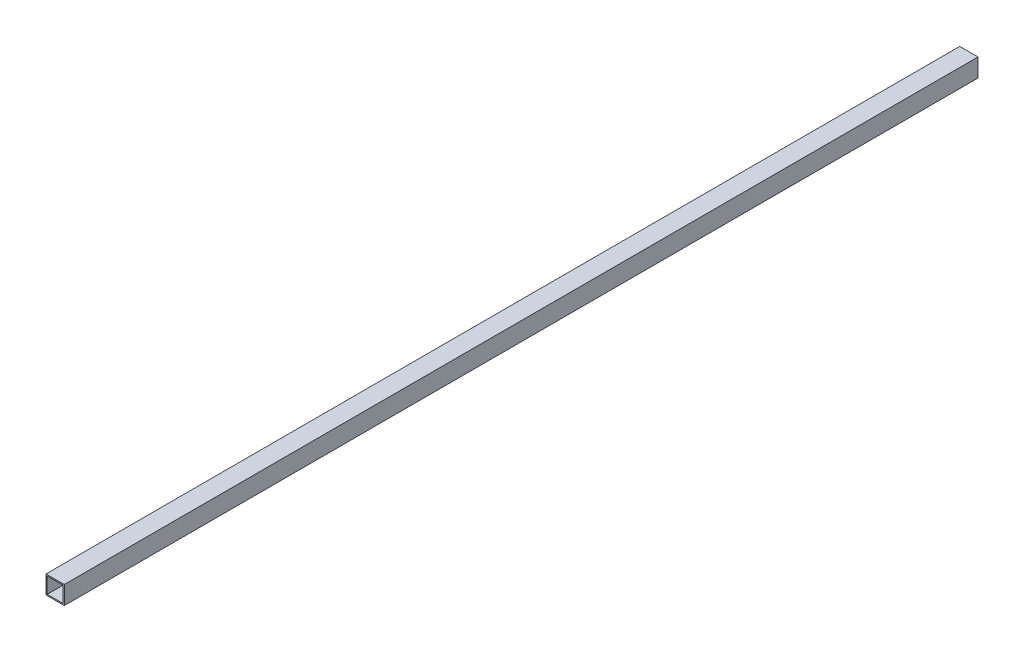
ISO-10303-21;
HEADER;
FILE_DESCRIPTION(('STEP AP214'),'2;1');
FILE_NAME('part.step','',(''),(''),'','','');
FILE_SCHEMA(('AUTOMOTIVE_DESIGN { 1 0 10303 214 1 1 1 1 }'));
ENDSEC;
DATA;
#1=APPLICATION_CONTEXT('core data for automotive mechanical design processes');
#2=APPLICATION_PROTOCOL_DEFINITION('international standard','automotive_design',2000,#1);
#3=PRODUCT_CONTEXT('',#1,'mechanical');
#4=PRODUCT('Part','Part','',(#3));
#5=PRODUCT_RELATED_PRODUCT_CATEGORY('part','',(#4));
#6=PRODUCT_DEFINITION_FORMATION('','',#4);
#7=PRODUCT_DEFINITION_CONTEXT('part definition',#1,'design');
#8=PRODUCT_DEFINITION('design','',#6,#7);
#9=PRODUCT_DEFINITION_SHAPE('','',#8);
#10=(LENGTH_UNIT() NAMED_UNIT(*) SI_UNIT(.MILLI.,.METRE.));
#11=(NAMED_UNIT(*) PLANE_ANGLE_UNIT() SI_UNIT($,.RADIAN.));
#12=(NAMED_UNIT(*) SI_UNIT($,.STERADIAN.) SOLID_ANGLE_UNIT());
#13=UNCERTAINTY_MEASURE_WITH_UNIT(LENGTH_MEASURE(1.E-05),#10,'distance_accuracy_value','');
#14=(GEOMETRIC_REPRESENTATION_CONTEXT(3) GLOBAL_UNCERTAINTY_ASSIGNED_CONTEXT((#13)) GLOBAL_UNIT_ASSIGNED_CONTEXT((#10,
#11,#12)) REPRESENTATION_CONTEXT('',''));
#15=CARTESIAN_POINT('',(0.,0.,0.));
#16=DIRECTION('',(0.,0.,1.));
#17=DIRECTION('',(1.,0.,0.));
#18=AXIS2_PLACEMENT_3D('',#15,#16,#17);
#19=CARTESIAN_POINT('',(0.,30.,1500.));
#20=DIRECTION('',(0.,1.,0.));
#21=DIRECTION('',(0.,0.,1.));
#22=AXIS2_PLACEMENT_3D('',#19,#20,#21);
#23=PLANE('',#22);
#24=DIRECTION('',(1.,0.,0.));
#25=VECTOR('',#24,1.);
#26=CARTESIAN_POINT('',(0.,30.,0.));
#27=LINE('',#26,#25);
#28=CARTESIAN_POINT('',(0.,30.,0.));
#29=VERTEX_POINT('',#28);
#30=CARTESIAN_POINT('',(30.,30.,0.));
#31=VERTEX_POINT('',#30);
#32=EDGE_CURVE('E162',#29,#31,#27,.T.);
#33=ORIENTED_EDGE('',*,*,#32,.F.);
#34=DIRECTION('',(0.,0.,-1.));
#35=VECTOR('',#34,1.);
#36=CARTESIAN_POINT('',(0.,30.,1500.));
#37=LINE('',#36,#35);
#38=CARTESIAN_POINT('',(0.,30.,1500.));
#39=VERTEX_POINT('',#38);
#40=EDGE_CURVE('E11',#39,#29,#37,.T.);
#41=ORIENTED_EDGE('',*,*,#40,.F.);
#42=DIRECTION('',(1.,0.,0.));
#43=VECTOR('',#42,1.);
#44=CARTESIAN_POINT('',(0.,30.,1500.));
#45=LINE('',#44,#43);
#46=CARTESIAN_POINT('',(30.,30.,1500.));
#47=VERTEX_POINT('',#46);
#48=EDGE_CURVE('E136',#39,#47,#45,.T.);
#49=ORIENTED_EDGE('',*,*,#48,.T.);
#50=DIRECTION('',(0.,0.,-1.));
#51=VECTOR('',#50,1.);
#52=CARTESIAN_POINT('',(30.,30.,1500.));
#53=LINE('',#52,#51);
#54=EDGE_CURVE('E96',#47,#31,#53,.T.);
#55=ORIENTED_EDGE('',*,*,#54,.T.);
#56=EDGE_LOOP('',(#33,#41,#49,#55));
#57=FACE_BOUND('',#56,.T.);
#58=ADVANCED_FACE('F41',(#57),#23,.T.);
#59=CARTESIAN_POINT('',(0.,0.,1500.));
#60=DIRECTION('',(-1.,0.,0.));
#61=DIRECTION('',(0.,0.,1.));
#62=AXIS2_PLACEMENT_3D('',#59,#60,#61);
#63=PLANE('',#62);
#64=DIRECTION('',(0.,1.,0.));
#65=VECTOR('',#64,1.);
#66=CARTESIAN_POINT('',(0.,0.,0.));
#67=LINE('',#66,#65);
#68=CARTESIAN_POINT('',(0.,0.,0.));
#69=VERTEX_POINT('',#68);
#70=EDGE_CURVE('E124',#69,#29,#67,.T.);
#71=ORIENTED_EDGE('',*,*,#70,.F.);
#72=DIRECTION('',(0.,0.,-1.));
#73=VECTOR('',#72,1.);
#74=CARTESIAN_POINT('',(0.,0.,1500.));
#75=LINE('',#74,#73);
#76=CARTESIAN_POINT('',(0.,0.,1500.));
#77=VERTEX_POINT('',#76);
#78=EDGE_CURVE('E52',#77,#69,#75,.T.);
#79=ORIENTED_EDGE('',*,*,#78,.F.);
#80=DIRECTION('',(0.,1.,0.));
#81=VECTOR('',#80,1.);
#82=CARTESIAN_POINT('',(0.,0.,1500.));
#83=LINE('',#82,#81);
#84=EDGE_CURVE('E122',#77,#39,#83,.T.);
#85=ORIENTED_EDGE('',*,*,#84,.T.);
#86=ORIENTED_EDGE('',*,*,#40,.T.);
#87=EDGE_LOOP('',(#71,#79,#85,#86));
#88=FACE_BOUND('',#87,.T.);
#89=ADVANCED_FACE('F120',(#88),#63,.T.);
#90=CARTESIAN_POINT('',(0.,0.,1500.));
#91=DIRECTION('',(0.,1.,0.));
#92=DIRECTION('',(0.,0.,1.));
#93=AXIS2_PLACEMENT_3D('',#90,#91,#92);
#94=PLANE('',#93);
#95=DIRECTION('',(1.,0.,0.));
#96=VECTOR('',#95,1.);
#97=CARTESIAN_POINT('',(0.,0.,0.));
#98=LINE('',#97,#96);
#99=CARTESIAN_POINT('',(30.,0.,0.));
#100=VERTEX_POINT('',#99);
#101=EDGE_CURVE('E167',#69,#100,#98,.T.);
#102=ORIENTED_EDGE('',*,*,#101,.T.);
#103=DIRECTION('',(0.,0.,-1.));
#104=VECTOR('',#103,1.);
#105=CARTESIAN_POINT('',(30.,0.,1500.));
#106=LINE('',#105,#104);
#107=CARTESIAN_POINT('',(30.,0.,1500.));
#108=VERTEX_POINT('',#107);
#109=EDGE_CURVE('E128',#108,#100,#106,.T.);
#110=ORIENTED_EDGE('',*,*,#109,.F.);
#111=DIRECTION('',(1.,0.,0.));
#112=VECTOR('',#111,1.);
#113=CARTESIAN_POINT('',(0.,0.,1500.));
#114=LINE('',#113,#112);
#115=EDGE_CURVE('E131',#77,#108,#114,.T.);
#116=ORIENTED_EDGE('',*,*,#115,.F.);
#117=ORIENTED_EDGE('',*,*,#78,.T.);
#118=EDGE_LOOP('',(#102,#110,#116,#117));
#119=FACE_BOUND('',#118,.T.);
#120=ADVANCED_FACE('F132',(#119),#94,.F.);
#121=CARTESIAN_POINT('',(2.00000000000005,0.,1500.));
#122=DIRECTION('',(1.,0.,0.));
#123=DIRECTION('',(0.,1.,0.));
#124=AXIS2_PLACEMENT_3D('',#121,#122,#123);
#125=PLANE('',#124);
#126=DIRECTION('',(0.,-1.,0.));
#127=VECTOR('',#126,1.);
#128=CARTESIAN_POINT('',(2.00000000000005,0.,0.));
#129=LINE('',#128,#127);
#130=CARTESIAN_POINT('',(2.00000000000005,28.,0.));
#131=VERTEX_POINT('',#130);
#132=CARTESIAN_POINT('',(2.00000000000005,2.,0.));
#133=VERTEX_POINT('',#132);
#134=EDGE_CURVE('E147',#131,#133,#129,.T.);
#135=ORIENTED_EDGE('',*,*,#134,.F.);
#136=DIRECTION('',(0.,0.,-1.));
#137=VECTOR('',#136,1.);
#138=CARTESIAN_POINT('',(2.00000000000005,28.,1500.));
#139=LINE('',#138,#137);
#140=CARTESIAN_POINT('',(2.00000000000005,28.,1500.));
#141=VERTEX_POINT('',#140);
#142=EDGE_CURVE('E45',#141,#131,#139,.T.);
#143=ORIENTED_EDGE('',*,*,#142,.F.);
#144=DIRECTION('',(0.,-1.,0.));
#145=VECTOR('',#144,1.);
#146=CARTESIAN_POINT('',(2.00000000000005,0.,1500.));
#147=LINE('',#146,#145);
#148=CARTESIAN_POINT('',(2.00000000000005,2.,1500.));
#149=VERTEX_POINT('',#148);
#150=EDGE_CURVE('E172',#141,#149,#147,.T.);
#151=ORIENTED_EDGE('',*,*,#150,.T.);
#152=DIRECTION('',(0.,0.,-1.));
#153=VECTOR('',#152,1.);
#154=CARTESIAN_POINT('',(2.00000000000005,2.,1500.));
#155=LINE('',#154,#153);
#156=EDGE_CURVE('E146',#149,#133,#155,.T.);
#157=ORIENTED_EDGE('',*,*,#156,.T.);
#158=EDGE_LOOP('',(#135,#143,#151,#157));
#159=FACE_BOUND('',#158,.T.);
#160=ADVANCED_FACE('F43',(#159),#125,.T.);
#161=CARTESIAN_POINT('',(0.,28.,1500.));
#162=DIRECTION('',(0.,1.,0.));
#163=DIRECTION('',(-1.,0.,0.));
#164=AXIS2_PLACEMENT_3D('',#161,#162,#163);
#165=PLANE('',#164);
#166=DIRECTION('',(1.,0.,0.));
#167=VECTOR('',#166,1.);
#168=CARTESIAN_POINT('',(0.,28.,0.));
#169=LINE('',#168,#167);
#170=CARTESIAN_POINT('',(28.,28.,0.));
#171=VERTEX_POINT('',#170);
#172=EDGE_CURVE('E151',#131,#171,#169,.T.);
#173=ORIENTED_EDGE('',*,*,#172,.T.);
#174=DIRECTION('',(0.,0.,-1.));
#175=VECTOR('',#174,1.);
#176=CARTESIAN_POINT('',(28.,28.,1500.));
#177=LINE('',#176,#175);
#178=CARTESIAN_POINT('',(28.,28.,1500.));
#179=VERTEX_POINT('',#178);
#180=EDGE_CURVE('E181',#179,#171,#177,.T.);
#181=ORIENTED_EDGE('',*,*,#180,.F.);
#182=DIRECTION('',(1.,0.,0.));
#183=VECTOR('',#182,1.);
#184=CARTESIAN_POINT('',(0.,28.,1500.));
#185=LINE('',#184,#183);
#186=EDGE_CURVE('E192',#141,#179,#185,.T.);
#187=ORIENTED_EDGE('',*,*,#186,.F.);
#188=ORIENTED_EDGE('',*,*,#142,.T.);
#189=EDGE_LOOP('',(#173,#181,#187,#188));
#190=FACE_BOUND('',#189,.T.);
#191=ADVANCED_FACE('F191',(#190),#165,.F.);
#192=CARTESIAN_POINT('',(28.,0.,1500.));
#193=DIRECTION('',(1.,0.,0.));
#194=DIRECTION('',(0.,1.,0.));
#195=AXIS2_PLACEMENT_3D('',#192,#193,#194);
#196=PLANE('',#195);
#197=DIRECTION('',(0.,-1.,0.));
#198=VECTOR('',#197,1.);
#199=CARTESIAN_POINT('',(28.,0.,0.));
#200=LINE('',#199,#198);
#201=CARTESIAN_POINT('',(28.,2.,0.));
#202=VERTEX_POINT('',#201);
#203=EDGE_CURVE('E154',#171,#202,#200,.T.);
#204=ORIENTED_EDGE('',*,*,#203,.T.);
#205=DIRECTION('',(0.,0.,-1.));
#206=VECTOR('',#205,1.);
#207=CARTESIAN_POINT('',(28.,2.,1500.));
#208=LINE('',#207,#206);
#209=CARTESIAN_POINT('',(28.,2.,1500.));
#210=VERTEX_POINT('',#209);
#211=EDGE_CURVE('E179',#210,#202,#208,.T.);
#212=ORIENTED_EDGE('',*,*,#211,.F.);
#213=DIRECTION('',(0.,-1.,0.));
#214=VECTOR('',#213,1.);
#215=CARTESIAN_POINT('',(28.,0.,1500.));
#216=LINE('',#215,#214);
#217=EDGE_CURVE('E232',#179,#210,#216,.T.);
#218=ORIENTED_EDGE('',*,*,#217,.F.);
#219=ORIENTED_EDGE('',*,*,#180,.T.);
#220=EDGE_LOOP('',(#204,#212,#218,#219));
#221=FACE_BOUND('',#220,.T.);
#222=ADVANCED_FACE('F202',(#221),#196,.F.);
#223=CARTESIAN_POINT('',(0.,2.,1500.));
#224=DIRECTION('',(0.,1.,0.));
#225=DIRECTION('',(0.,0.,1.));
#226=AXIS2_PLACEMENT_3D('',#223,#224,#225);
#227=PLANE('',#226);
#228=DIRECTION('',(1.,0.,0.));
#229=VECTOR('',#228,1.);
#230=CARTESIAN_POINT('',(0.,2.,0.));
#231=LINE('',#230,#229);
#232=EDGE_CURVE('E158',#133,#202,#231,.T.);
#233=ORIENTED_EDGE('',*,*,#232,.F.);
#234=ORIENTED_EDGE('',*,*,#156,.F.);
#235=DIRECTION('',(1.,0.,0.));
#236=VECTOR('',#235,1.);
#237=CARTESIAN_POINT('',(0.,2.,1500.));
#238=LINE('',#237,#236);
#239=EDGE_CURVE('E140',#149,#210,#238,.T.);
#240=ORIENTED_EDGE('',*,*,#239,.T.);
#241=ORIENTED_EDGE('',*,*,#211,.T.);
#242=EDGE_LOOP('',(#233,#234,#240,#241));
#243=FACE_BOUND('',#242,.T.);
#244=ADVANCED_FACE('F200',(#243),#227,.T.);
#245=CARTESIAN_POINT('',(30.,0.,1500.));
#246=DIRECTION('',(-1.,0.,0.));
#247=DIRECTION('',(0.,0.,1.));
#248=AXIS2_PLACEMENT_3D('',#245,#246,#247);
#249=PLANE('',#248);
#250=DIRECTION('',(0.,1.,0.));
#251=VECTOR('',#250,1.);
#252=CARTESIAN_POINT('',(30.,0.,0.));
#253=LINE('',#252,#251);
#254=EDGE_CURVE('E89',#100,#31,#253,.T.);
#255=ORIENTED_EDGE('',*,*,#254,.T.);
#256=ORIENTED_EDGE('',*,*,#54,.F.);
#257=DIRECTION('',(0.,1.,0.));
#258=VECTOR('',#257,1.);
#259=CARTESIAN_POINT('',(30.,0.,1500.));
#260=LINE('',#259,#258);
#261=EDGE_CURVE('E61',#108,#47,#260,.T.);
#262=ORIENTED_EDGE('',*,*,#261,.F.);
#263=ORIENTED_EDGE('',*,*,#109,.T.);
#264=EDGE_LOOP('',(#255,#256,#262,#263));
#265=FACE_BOUND('',#264,.T.);
#266=ADVANCED_FACE('F209',(#265),#249,.F.);
#267=CARTESIAN_POINT('',(0.,0.,1500.));
#268=DIRECTION('',(0.,0.,1.));
#269=DIRECTION('',(1.,0.,0.));
#270=AXIS2_PLACEMENT_3D('',#267,#268,#269);
#271=PLANE('',#270);
#272=ORIENTED_EDGE('',*,*,#150,.F.);
#273=ORIENTED_EDGE('',*,*,#186,.T.);
#274=ORIENTED_EDGE('',*,*,#217,.T.);
#275=ORIENTED_EDGE('',*,*,#239,.F.);
#276=EDGE_LOOP('',(#272,#273,#274,#275));
#277=FACE_BOUND('',#276,.T.);
#278=ORIENTED_EDGE('',*,*,#48,.F.);
#279=ORIENTED_EDGE('',*,*,#84,.F.);
#280=ORIENTED_EDGE('',*,*,#115,.T.);
#281=ORIENTED_EDGE('',*,*,#261,.T.);
#282=EDGE_LOOP('',(#278,#279,#280,#281));
#283=FACE_BOUND('',#282,.T.);
#284=ADVANCED_FACE('F135',(#277,#283),#271,.T.);
#285=CARTESIAN_POINT('',(0.,0.,0.));
#286=DIRECTION('',(0.,0.,1.));
#287=DIRECTION('',(1.,0.,0.));
#288=AXIS2_PLACEMENT_3D('',#285,#286,#287);
#289=PLANE('',#288);
#290=ORIENTED_EDGE('',*,*,#134,.T.);
#291=ORIENTED_EDGE('',*,*,#232,.T.);
#292=ORIENTED_EDGE('',*,*,#203,.F.);
#293=ORIENTED_EDGE('',*,*,#172,.F.);
#294=EDGE_LOOP('',(#290,#291,#292,#293));
#295=FACE_BOUND('',#294,.T.);
#296=ORIENTED_EDGE('',*,*,#32,.T.);
#297=ORIENTED_EDGE('',*,*,#254,.F.);
#298=ORIENTED_EDGE('',*,*,#101,.F.);
#299=ORIENTED_EDGE('',*,*,#70,.T.);
#300=EDGE_LOOP('',(#296,#297,#298,#299));
#301=FACE_BOUND('',#300,.T.);
#302=ADVANCED_FACE('F195',(#295,#301),#289,.F.);
#303=CLOSED_SHELL('',(#58,#89,#120,#160,#191,#222,#244,#266,#284,#302));
#304=MANIFOLD_SOLID_BREP('B2',#303);
#305=ADVANCED_BREP_SHAPE_REPRESENTATION('',(#18,#304),#14);
#306=SHAPE_DEFINITION_REPRESENTATION(#9,#305);
ENDSEC;
END-ISO-10303-21;
